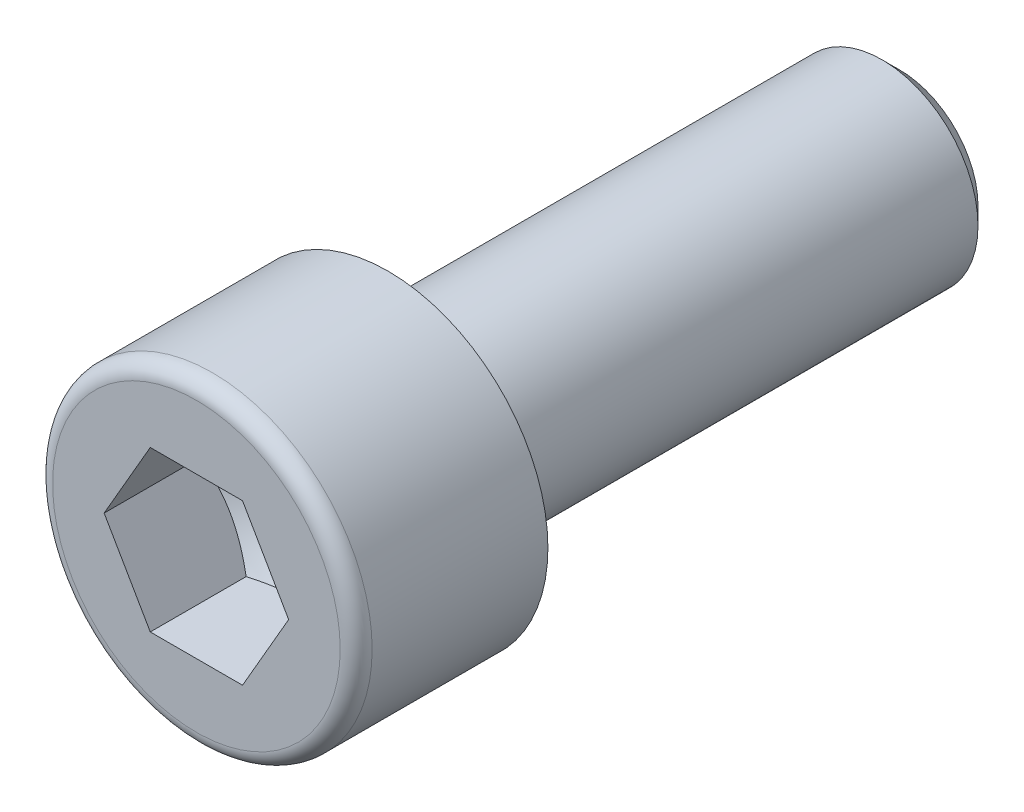
ISO-10303-21;
HEADER;
FILE_DESCRIPTION(('STEP AP214'),'2;1');
FILE_NAME('part.step','',(''),(''),'','','');
FILE_SCHEMA(('AUTOMOTIVE_DESIGN { 1 0 10303 214 1 1 1 1 }'));
ENDSEC;
DATA;
#1=APPLICATION_CONTEXT('core data for automotive mechanical design processes');
#2=APPLICATION_PROTOCOL_DEFINITION('international standard','automotive_design',2000,#1);
#3=PRODUCT_CONTEXT('',#1,'mechanical');
#4=PRODUCT('Part','Part','',(#3));
#5=PRODUCT_RELATED_PRODUCT_CATEGORY('part','',(#4));
#6=PRODUCT_DEFINITION_FORMATION('','',#4);
#7=PRODUCT_DEFINITION_CONTEXT('part definition',#1,'design');
#8=PRODUCT_DEFINITION('design','',#6,#7);
#9=PRODUCT_DEFINITION_SHAPE('','',#8);
#10=(LENGTH_UNIT() NAMED_UNIT(*) SI_UNIT(.MILLI.,.METRE.));
#11=(NAMED_UNIT(*) PLANE_ANGLE_UNIT() SI_UNIT($,.RADIAN.));
#12=(NAMED_UNIT(*) SI_UNIT($,.STERADIAN.) SOLID_ANGLE_UNIT());
#13=UNCERTAINTY_MEASURE_WITH_UNIT(LENGTH_MEASURE(1.E-05),#10,'distance_accuracy_value','');
#14=(GEOMETRIC_REPRESENTATION_CONTEXT(3) GLOBAL_UNCERTAINTY_ASSIGNED_CONTEXT((#13)) GLOBAL_UNIT_ASSIGNED_CONTEXT((#10,
#11,#12)) REPRESENTATION_CONTEXT('',''));
#15=CARTESIAN_POINT('',(0.,0.,0.));
#16=DIRECTION('',(0.,0.,1.));
#17=DIRECTION('',(1.,0.,0.));
#18=AXIS2_PLACEMENT_3D('',#15,#16,#17);
#19=CARTESIAN_POINT('',(0.,0.,6.));
#20=DIRECTION('',(0.,0.,1.));
#21=DIRECTION('',(1.,0.,0.));
#22=AXIS2_PLACEMENT_3D('',#19,#20,#21);
#23=PLANE('',#22);
#24=CARTESIAN_POINT('',(0.,0.,6.));
#25=DIRECTION('',(0.,0.,1.));
#26=DIRECTION('',(1.,0.,0.));
#27=AXIS2_PLACEMENT_3D('',#24,#25,#26);
#28=CIRCLE('',#27,4.5);
#29=CARTESIAN_POINT('',(4.5,0.,6.));
#30=VERTEX_POINT('',#29);
#31=EDGE_CURVE('E11',#30,#30,#28,.T.);
#32=ORIENTED_EDGE('',*,*,#31,.T.);
#33=EDGE_LOOP('',(#32));
#34=FACE_BOUND('',#33,.T.);
#35=DIRECTION('',(1.,0.,0.));
#36=VECTOR('',#35,1.);
#37=CARTESIAN_POINT('',(-1.443375,2.49999883437473,6.));
#38=LINE('',#37,#36);
#39=CARTESIAN_POINT('',(-1.443375,2.49999883437473,6.));
#40=VERTEX_POINT('',#39);
#41=CARTESIAN_POINT('',(1.443375,2.49999883437473,6.));
#42=VERTEX_POINT('',#41);
#43=EDGE_CURVE('E92',#40,#42,#38,.T.);
#44=ORIENTED_EDGE('',*,*,#43,.T.);
#45=DIRECTION('',(0.5,-0.866025403784439,0.));
#46=VECTOR('',#45,1.);
#47=CARTESIAN_POINT('',(1.443375,2.49999883437473,6.));
#48=LINE('',#47,#46);
#49=CARTESIAN_POINT('',(2.88675,0.,6.));
#50=VERTEX_POINT('',#49);
#51=EDGE_CURVE('E31',#42,#50,#48,.T.);
#52=ORIENTED_EDGE('',*,*,#51,.T.);
#53=DIRECTION('',(-0.5,-0.866025403784439,0.));
#54=VECTOR('',#53,1.);
#55=CARTESIAN_POINT('',(2.88675,0.,6.));
#56=LINE('',#55,#54);
#57=CARTESIAN_POINT('',(1.443375,-2.49999883437473,6.));
#58=VERTEX_POINT('',#57);
#59=EDGE_CURVE('E169',#50,#58,#56,.T.);
#60=ORIENTED_EDGE('',*,*,#59,.T.);
#61=DIRECTION('',(-1.,0.,0.));
#62=VECTOR('',#61,1.);
#63=CARTESIAN_POINT('',(1.443375,-2.49999883437473,6.));
#64=LINE('',#63,#62);
#65=CARTESIAN_POINT('',(-1.443375,-2.49999883437473,6.));
#66=VERTEX_POINT('',#65);
#67=EDGE_CURVE('E165',#58,#66,#64,.T.);
#68=ORIENTED_EDGE('',*,*,#67,.T.);
#69=DIRECTION('',(-0.5,0.866025403784439,0.));
#70=VECTOR('',#69,1.);
#71=CARTESIAN_POINT('',(-1.443375,-2.49999883437473,6.));
#72=LINE('',#71,#70);
#73=CARTESIAN_POINT('',(-2.88675,0.,6.));
#74=VERTEX_POINT('',#73);
#75=EDGE_CURVE('E160',#66,#74,#72,.T.);
#76=ORIENTED_EDGE('',*,*,#75,.T.);
#77=DIRECTION('',(0.5,0.866025403784439,0.));
#78=VECTOR('',#77,1.);
#79=CARTESIAN_POINT('',(-2.88675,0.,6.));
#80=LINE('',#79,#78);
#81=EDGE_CURVE('E96',#74,#40,#80,.T.);
#82=ORIENTED_EDGE('',*,*,#81,.T.);
#83=EDGE_LOOP('',(#44,#52,#60,#68,#76,#82));
#84=FACE_BOUND('',#83,.T.);
#85=ADVANCED_FACE('F17',(#34,#84),#23,.T.);
#86=CARTESIAN_POINT('',(0.,0.,5.5));
#87=DIRECTION('',(0.,0.,1.));
#88=DIRECTION('',(1.,0.,0.));
#89=AXIS2_PLACEMENT_3D('',#86,#87,#88);
#90=TOROIDAL_SURFACE('',#89,4.5,0.5);
#91=ORIENTED_EDGE('',*,*,#31,.F.);
#92=EDGE_LOOP('',(#91));
#93=FACE_BOUND('',#92,.T.);
#94=CARTESIAN_POINT('',(0.,0.,5.5));
#95=DIRECTION('',(0.,0.,1.));
#96=DIRECTION('',(1.,0.,0.));
#97=AXIS2_PLACEMENT_3D('',#94,#95,#96);
#98=CIRCLE('',#97,5.);
#99=CARTESIAN_POINT('',(5.,0.,5.5));
#100=VERTEX_POINT('',#99);
#101=EDGE_CURVE('E24',#100,#100,#98,.T.);
#102=ORIENTED_EDGE('',*,*,#101,.T.);
#103=EDGE_LOOP('',(#102));
#104=FACE_BOUND('',#103,.T.);
#105=ADVANCED_FACE('F133',(#93,#104),#90,.T.);
#106=CARTESIAN_POINT('',(0.,0.,6.));
#107=DIRECTION('',(0.,0.,1.));
#108=DIRECTION('',(1.,0.,0.));
#109=AXIS2_PLACEMENT_3D('',#106,#107,#108);
#110=CYLINDRICAL_SURFACE('',#109,5.);
#111=CARTESIAN_POINT('',(0.,0.,0.));
#112=DIRECTION('',(0.,0.,1.));
#113=DIRECTION('',(1.,0.,0.));
#114=AXIS2_PLACEMENT_3D('',#111,#112,#113);
#115=CIRCLE('',#114,5.);
#116=CARTESIAN_POINT('',(5.,0.,0.));
#117=VERTEX_POINT('',#116);
#118=EDGE_CURVE('E128',#117,#117,#115,.T.);
#119=ORIENTED_EDGE('',*,*,#118,.T.);
#120=EDGE_LOOP('',(#119));
#121=FACE_BOUND('',#120,.T.);
#122=ORIENTED_EDGE('',*,*,#101,.F.);
#123=EDGE_LOOP('',(#122));
#124=FACE_BOUND('',#123,.T.);
#125=ADVANCED_FACE('F135',(#121,#124),#110,.T.);
#126=CARTESIAN_POINT('',(0.,5.,0.));
#127=DIRECTION('',(0.,0.,-1.));
#128=DIRECTION('',(-1.,0.,0.));
#129=AXIS2_PLACEMENT_3D('',#126,#127,#128);
#130=PLANE('',#129);
#131=CARTESIAN_POINT('',(0.,0.,0.));
#132=DIRECTION('',(0.,0.,1.));
#133=DIRECTION('',(1.,0.,0.));
#134=AXIS2_PLACEMENT_3D('',#131,#132,#133);
#135=CIRCLE('',#134,3.3);
#136=CARTESIAN_POINT('',(3.3,0.,0.));
#137=VERTEX_POINT('',#136);
#138=EDGE_CURVE('E125',#137,#137,#135,.T.);
#139=ORIENTED_EDGE('',*,*,#138,.T.);
#140=EDGE_LOOP('',(#139));
#141=FACE_BOUND('',#140,.T.);
#142=ORIENTED_EDGE('',*,*,#118,.F.);
#143=EDGE_LOOP('',(#142));
#144=FACE_BOUND('',#143,.T.);
#145=ADVANCED_FACE('F137',(#141,#144),#130,.T.);
#146=CARTESIAN_POINT('',(0.,0.,-0.3));
#147=DIRECTION('',(0.,0.,1.));
#148=DIRECTION('',(1.,0.,0.));
#149=AXIS2_PLACEMENT_3D('',#146,#147,#148);
#150=TOROIDAL_SURFACE('',#149,3.3,0.3);
#151=CARTESIAN_POINT('',(0.,0.,-0.3));
#152=DIRECTION('',(0.,0.,1.));
#153=DIRECTION('',(1.,0.,0.));
#154=AXIS2_PLACEMENT_3D('',#151,#152,#153);
#155=CIRCLE('',#154,3.);
#156=CARTESIAN_POINT('',(3.,0.,-0.3));
#157=VERTEX_POINT('',#156);
#158=EDGE_CURVE('E122',#157,#157,#155,.T.);
#159=ORIENTED_EDGE('',*,*,#158,.T.);
#160=EDGE_LOOP('',(#159));
#161=FACE_BOUND('',#160,.T.);
#162=ORIENTED_EDGE('',*,*,#138,.F.);
#163=EDGE_LOOP('',(#162));
#164=FACE_BOUND('',#163,.T.);
#165=ADVANCED_FACE('F145',(#161,#164),#150,.F.);
#166=CARTESIAN_POINT('',(0.,0.,6.));
#167=DIRECTION('',(0.,0.,1.));
#168=DIRECTION('',(1.,0.,0.));
#169=AXIS2_PLACEMENT_3D('',#166,#167,#168);
#170=CYLINDRICAL_SURFACE('',#169,3.);
#171=CARTESIAN_POINT('',(0.,0.,-0.301));
#172=DIRECTION('',(0.,0.,1.));
#173=DIRECTION('',(1.,0.,0.));
#174=AXIS2_PLACEMENT_3D('',#171,#172,#173);
#175=CIRCLE('',#174,3.);
#176=CARTESIAN_POINT('',(3.,0.,-0.301));
#177=VERTEX_POINT('',#176);
#178=EDGE_CURVE('E119',#177,#177,#175,.T.);
#179=ORIENTED_EDGE('',*,*,#178,.T.);
#180=EDGE_LOOP('',(#179));
#181=FACE_BOUND('',#180,.T.);
#182=ORIENTED_EDGE('',*,*,#158,.F.);
#183=EDGE_LOOP('',(#182));
#184=FACE_BOUND('',#183,.T.);
#185=ADVANCED_FACE('F346',(#181,#184),#170,.T.);
#186=CARTESIAN_POINT('',(0.,0.,-0.301));
#187=DIRECTION('',(0.,0.,1.));
#188=DIRECTION('',(1.,0.,0.));
#189=AXIS2_PLACEMENT_3D('',#186,#187,#188);
#190=CONICAL_SURFACE('',#189,3.,0.523598775598299);
#191=CARTESIAN_POINT('',(0.,0.,-1.23847249959665));
#192=DIRECTION('',(0.,0.,1.));
#193=DIRECTION('',(1.,0.,0.));
#194=AXIS2_PLACEMENT_3D('',#191,#192,#193);
#195=CIRCLE('',#194,2.45875);
#196=CARTESIAN_POINT('',(2.45875,0.,-1.23847249959665));
#197=VERTEX_POINT('',#196);
#198=EDGE_CURVE('E116',#197,#197,#195,.T.);
#199=ORIENTED_EDGE('',*,*,#198,.T.);
#200=EDGE_LOOP('',(#199));
#201=FACE_BOUND('',#200,.T.);
#202=ORIENTED_EDGE('',*,*,#178,.F.);
#203=EDGE_LOOP('',(#202));
#204=FACE_BOUND('',#203,.T.);
#205=ADVANCED_FACE('F337',(#201,#204),#190,.T.);
#206=CARTESIAN_POINT('',(0.,2.45875,-1.23847249959665));
#207=DIRECTION('',(0.,0.,1.));
#208=DIRECTION('',(1.,0.,0.));
#209=AXIS2_PLACEMENT_3D('',#206,#207,#208);
#210=PLANE('',#209);
#211=CARTESIAN_POINT('',(0.,0.,-1.23847249959665));
#212=DIRECTION('',(0.,0.,1.));
#213=DIRECTION('',(1.,0.,0.));
#214=AXIS2_PLACEMENT_3D('',#211,#212,#213);
#215=CIRCLE('',#214,3.);
#216=CARTESIAN_POINT('',(3.,0.,-1.23847249959665));
#217=VERTEX_POINT('',#216);
#218=EDGE_CURVE('E113',#217,#217,#215,.T.);
#219=ORIENTED_EDGE('',*,*,#218,.T.);
#220=EDGE_LOOP('',(#219));
#221=FACE_BOUND('',#220,.T.);
#222=ORIENTED_EDGE('',*,*,#198,.F.);
#223=EDGE_LOOP('',(#222));
#224=FACE_BOUND('',#223,.T.);
#225=ADVANCED_FACE('F322',(#221,#224),#210,.T.);
#226=CARTESIAN_POINT('',(0.,0.,6.));
#227=DIRECTION('',(0.,0.,1.));
#228=DIRECTION('',(1.,0.,0.));
#229=AXIS2_PLACEMENT_3D('',#226,#227,#228);
#230=CYLINDRICAL_SURFACE('',#229,3.);
#231=CARTESIAN_POINT('',(0.,0.,-15.45875));
#232=DIRECTION('',(0.,0.,1.));
#233=DIRECTION('',(1.,0.,0.));
#234=AXIS2_PLACEMENT_3D('',#231,#232,#233);
#235=CIRCLE('',#234,3.);
#236=CARTESIAN_POINT('',(3.,0.,-15.45875));
#237=VERTEX_POINT('',#236);
#238=EDGE_CURVE('E110',#237,#237,#235,.T.);
#239=ORIENTED_EDGE('',*,*,#238,.T.);
#240=EDGE_LOOP('',(#239));
#241=FACE_BOUND('',#240,.T.);
#242=ORIENTED_EDGE('',*,*,#218,.F.);
#243=EDGE_LOOP('',(#242));
#244=FACE_BOUND('',#243,.T.);
#245=ADVANCED_FACE('F311',(#241,#244),#230,.T.);
#246=CARTESIAN_POINT('',(0.,0.,-15.45875));
#247=DIRECTION('',(0.,0.,1.));
#248=DIRECTION('',(1.,0.,0.));
#249=AXIS2_PLACEMENT_3D('',#246,#247,#248);
#250=CONICAL_SURFACE('',#249,3.,0.78539816339745);
#251=CARTESIAN_POINT('',(0.,0.,-16.));
#252=DIRECTION('',(0.,0.,1.));
#253=DIRECTION('',(1.,0.,0.));
#254=AXIS2_PLACEMENT_3D('',#251,#252,#253);
#255=CIRCLE('',#254,2.45875);
#256=CARTESIAN_POINT('',(2.45875,0.,-16.));
#257=VERTEX_POINT('',#256);
#258=EDGE_CURVE('E107',#257,#257,#255,.T.);
#259=ORIENTED_EDGE('',*,*,#258,.T.);
#260=EDGE_LOOP('',(#259));
#261=FACE_BOUND('',#260,.T.);
#262=ORIENTED_EDGE('',*,*,#238,.F.);
#263=EDGE_LOOP('',(#262));
#264=FACE_BOUND('',#263,.T.);
#265=ADVANCED_FACE('F303',(#261,#264),#250,.T.);
#266=CARTESIAN_POINT('',(0.,2.45875,-16.));
#267=DIRECTION('',(0.,0.,-1.));
#268=DIRECTION('',(-1.,0.,0.));
#269=AXIS2_PLACEMENT_3D('',#266,#267,#268);
#270=PLANE('',#269);
#271=ORIENTED_EDGE('',*,*,#258,.F.);
#272=EDGE_LOOP('',(#271));
#273=FACE_BOUND('',#272,.T.);
#274=ADVANCED_FACE('F225',(#273),#270,.T.);
#275=CARTESIAN_POINT('',(1.443375,2.49999883437473,1.33333411041685));
#276=DIRECTION('',(-0.866025403784439,-0.5,0.));
#277=DIRECTION('',(-0.5,0.866025403784439,0.));
#278=AXIS2_PLACEMENT_3D('',#275,#276,#277);
#279=PLANE('',#278);
#280=DIRECTION('',(0.,0.,1.));
#281=VECTOR('',#280,1.);
#282=CARTESIAN_POINT('',(2.88675,0.,1.33333411041685));
#283=LINE('',#282,#281);
#284=CARTESIAN_POINT('',(2.88675,0.,3.));
#285=VERTEX_POINT('',#284);
#286=EDGE_CURVE('E105',#285,#50,#283,.T.);
#287=ORIENTED_EDGE('',*,*,#286,.T.);
#288=ORIENTED_EDGE('',*,*,#51,.F.);
#289=DIRECTION('',(0.,0.,1.));
#290=VECTOR('',#289,1.);
#291=CARTESIAN_POINT('',(1.443375,2.49999883437473,1.33333411041685));
#292=LINE('',#291,#290);
#293=CARTESIAN_POINT('',(1.443375,2.49999883437473,3.));
#294=VERTEX_POINT('',#293);
#295=EDGE_CURVE('E86',#294,#42,#292,.T.);
#296=ORIENTED_EDGE('',*,*,#295,.F.);
#297=CARTESIAN_POINT('',(2.88675011547006,-1.99999999863357E-07,3.00000006666667));
#298=CARTESIAN_POINT('',(2.82332252366581,0.10985961160669,2.96336950967828));
#299=CARTESIAN_POINT('',(2.75934742579574,0.220667731536841,2.93005593436152));
#300=CARTESIAN_POINT('',(2.63028954387127,0.444202540147256,2.87190808727666));
#301=CARTESIAN_POINT('',(2.56520446745334,0.556933199317605,2.84709438377072));
#302=CARTESIAN_POINT('',(2.43584088140159,0.780997503008549,2.80847006268835));
#303=CARTESIAN_POINT('',(2.37158227044588,0.892296682007636,2.7944023489199));
#304=CARTESIAN_POINT('',(2.24276284805613,1.11541846658835,2.77761157054617));
#305=CARTESIAN_POINT('',(2.17820250452486,1.22724026173863,2.77487459839365));
#306=CARTESIAN_POINT('',(2.05757841328359,1.43616731638533,2.78058295689796));
#307=CARTESIAN_POINT('',(2.00149656500914,1.53330392697905,2.7876266963322));
#308=CARTESIAN_POINT('',(1.8896982234341,1.72694433478895,2.80994670830941));
#309=CARTESIAN_POINT('',(1.83398211652594,1.82344746275382,2.82523059787334));
#310=CARTESIAN_POINT('',(1.72195345954662,2.01748678854571,2.86343736615338));
#311=CARTESIAN_POINT('',(1.66565508107193,2.11499844044762,2.88652212541071));
#312=CARTESIAN_POINT('',(1.55389777191142,2.3085677780308,2.93891477048972));
#313=CARTESIAN_POINT('',(1.49843741058811,2.40462794164891,2.96821035401504));
#314=CARTESIAN_POINT('',(1.44337488452994,2.49999903437473,3.00000006666667));
#315=B_SPLINE_CURVE_WITH_KNOTS('',3,(#297,#298,#299,#300,#301,#302,#303,#304,#305,#306,#307,
#308,#309,#310,#311,#312,#313,#314),.UNSPECIFIED.,.F.,.F.,(4,2,2,2,2,2,2,2,4),(0.,
0.396269845497158,0.793491933375094,1.18088400346178,1.56780044062153,1.90463400294076,
2.24177946228527,2.58640119548574,2.93034658115087),.UNSPECIFIED.);
#316=EDGE_CURVE('E79',#285,#294,#315,.T.);
#317=ORIENTED_EDGE('',*,*,#316,.F.);
#318=EDGE_LOOP('',(#287,#288,#296,#317));
#319=FACE_BOUND('',#318,.T.);
#320=ADVANCED_FACE('F87',(#319),#279,.T.);
#321=CARTESIAN_POINT('',(2.88675,0.,1.33333411041685));
#322=DIRECTION('',(-0.866025403784439,0.5,0.));
#323=DIRECTION('',(0.5,0.866025403784439,0.));
#324=AXIS2_PLACEMENT_3D('',#321,#322,#323);
#325=PLANE('',#324);
#326=DIRECTION('',(0.,0.,1.));
#327=VECTOR('',#326,1.);
#328=CARTESIAN_POINT('',(1.443375,-2.49999883437473,1.33333411041685));
#329=LINE('',#328,#327);
#330=CARTESIAN_POINT('',(1.443375,-2.49999883437473,3.));
#331=VERTEX_POINT('',#330);
#332=EDGE_CURVE('E103',#331,#58,#329,.T.);
#333=ORIENTED_EDGE('',*,*,#332,.T.);
#334=ORIENTED_EDGE('',*,*,#59,.F.);
#335=ORIENTED_EDGE('',*,*,#286,.F.);
#336=CARTESIAN_POINT('',(1.44337488452995,-2.49999903437473,3.00000006666667));
#337=CARTESIAN_POINT('',(1.50680247633419,-2.39013922276804,2.96336950967828));
#338=CARTESIAN_POINT('',(1.57077757420426,-2.27933110283789,2.93005593436152));
#339=CARTESIAN_POINT('',(1.69983545612873,-2.05579629422747,2.87190808727666));
#340=CARTESIAN_POINT('',(1.76492053254666,-1.94306563505712,2.84709438377072));
#341=CARTESIAN_POINT('',(1.89428411859841,-1.71900133136618,2.80847006268835));
#342=CARTESIAN_POINT('',(1.95854272955412,-1.60770215236709,2.7944023489199));
#343=CARTESIAN_POINT('',(2.08736215194387,-1.38458036778637,2.77761157054617));
#344=CARTESIAN_POINT('',(2.15192249547514,-1.2727585726361,2.77487459839365));
#345=CARTESIAN_POINT('',(2.27254658671641,-1.06383151798939,2.78058295689796));
#346=CARTESIAN_POINT('',(2.32862843499086,-0.96669490739568,2.7876266963322));
#347=CARTESIAN_POINT('',(2.4404267765659,-0.773054499585779,2.8099467083094));
#348=CARTESIAN_POINT('',(2.49614288347406,-0.676551371620907,2.82523059787334));
#349=CARTESIAN_POINT('',(2.60817154045338,-0.48251204582902,2.86343736615338));
#350=CARTESIAN_POINT('',(2.66446991892807,-0.385000393927105,2.88652212541071));
#351=CARTESIAN_POINT('',(2.77622722808858,-0.191431056343928,2.93891477048972));
#352=CARTESIAN_POINT('',(2.83168758941189,-0.0953708927258217,2.96821035401504));
#353=CARTESIAN_POINT('',(2.88675011547006,1.99999999976406E-07,3.00000006666667));
#354=B_SPLINE_CURVE_WITH_KNOTS('',3,(#336,#337,#338,#339,#340,#341,#342,#343,#344,#345,#346,
#347,#348,#349,#350,#351,#352,#353),.UNSPECIFIED.,.F.,.F.,(4,2,2,2,2,2,2,2,4),(0.,
0.396269845497159,0.793491933375095,1.18088400346178,1.56780044062153,1.90463400294076,
2.24177946228527,2.58640119548574,2.93034658115087),.UNSPECIFIED.);
#355=EDGE_CURVE('E83',#331,#285,#354,.T.);
#356=ORIENTED_EDGE('',*,*,#355,.F.);
#357=EDGE_LOOP('',(#333,#334,#335,#356));
#358=FACE_BOUND('',#357,.T.);
#359=ADVANCED_FACE('F216',(#358),#325,.T.);
#360=CARTESIAN_POINT('',(1.443375,-2.49999883437473,1.33333411041685));
#361=DIRECTION('',(0.,1.,0.));
#362=DIRECTION('',(1.,0.,0.));
#363=AXIS2_PLACEMENT_3D('',#360,#361,#362);
#364=PLANE('',#363);
#365=DIRECTION('',(0.,0.,1.));
#366=VECTOR('',#365,1.);
#367=CARTESIAN_POINT('',(-1.443375,-2.49999883437473,1.33333411041685));
#368=LINE('',#367,#366);
#369=CARTESIAN_POINT('',(-1.443375,-2.49999883437473,3.));
#370=VERTEX_POINT('',#369);
#371=EDGE_CURVE('E101',#370,#66,#368,.T.);
#372=ORIENTED_EDGE('',*,*,#371,.T.);
#373=ORIENTED_EDGE('',*,*,#67,.F.);
#374=ORIENTED_EDGE('',*,*,#332,.F.);
#375=CARTESIAN_POINT('',(-3.73786106214978,-2.49999883437473,3.92958778907324));
#376=CARTESIAN_POINT('',(-3.62896491195938,-2.49999883437473,3.87734398831161));
#377=CARTESIAN_POINT('',(-3.51980131110672,-2.49999883437473,3.82564701620672));
#378=CARTESIAN_POINT('',(-3.30079453275696,-2.49999883437473,3.72366066581967));
#379=CARTESIAN_POINT('',(-3.19095123199839,-2.49999883437473,3.67337155256083));
#380=CARTESIAN_POINT('',(-2.96980741137606,-2.49999883437473,3.57423266172552));
#381=CARTESIAN_POINT('',(-2.85850208851781,-2.49999883437473,3.5253935570836));
#382=CARTESIAN_POINT('',(-2.63494533066189,-2.49999883437473,3.42993961665011));
#383=CARTESIAN_POINT('',(-2.52269394848717,-2.49999883437473,3.38332465762953));
#384=CARTESIAN_POINT('',(-2.2960796228752,-2.49999883437473,3.29252281771904));
#385=CARTESIAN_POINT('',(-2.18170681392527,-2.49999883437473,3.2483604168365));
#386=CARTESIAN_POINT('',(-1.95158478593381,-2.49999883437473,3.16370836718421));
#387=CARTESIAN_POINT('',(-1.83583541308941,-2.49999883437473,3.12321913326025));
#388=CARTESIAN_POINT('',(-1.60304799958039,-2.49999883437473,3.04706130714345));
#389=CARTESIAN_POINT('',(-1.4860136544433,-2.49999883437473,3.01138153954989));
#390=CARTESIAN_POINT('',(-1.25028155584969,-2.49999883437473,2.94604587235114));
#391=CARTESIAN_POINT('',(-1.13158421230429,-2.49999883437473,2.91638851527048));
#392=CARTESIAN_POINT('',(-0.892146141983619,-2.49999883437473,2.86451911091829));
#393=CARTESIAN_POINT('',(-0.771400115486069,-2.49999883437473,2.84233105195638));
#394=CARTESIAN_POINT('',(-0.528550538126974,-2.49999883437473,2.8070567548414));
#395=CARTESIAN_POINT('',(-0.406446967923683,-2.49999883437473,2.7939706465386));
#396=CARTESIAN_POINT('',(-0.162227421037293,-2.49999883437473,2.77805851853028));
#397=CARTESIAN_POINT('',(-0.0401151733531879,-2.49999883437473,2.77517671003708));
#398=CARTESIAN_POINT('',(0.203885891243259,-2.49999883437473,2.77978959871521));
#399=CARTESIAN_POINT('',(0.325774751512606,-2.49999883437473,2.78728200631532));
#400=CARTESIAN_POINT('',(0.536617165080476,-2.49999883437473,2.80870547357712));
#401=CARTESIAN_POINT('',(0.625806204585235,-2.49999883437473,2.82042640123085));
#402=CARTESIAN_POINT('',(0.803437024790562,-2.49999883437473,2.84861382064688));
#403=CARTESIAN_POINT('',(0.891878680031716,-2.49999883437473,2.86508109348135));
#404=CARTESIAN_POINT('',(1.1562492807378,-2.49999883437473,2.92077504184743));
#405=CARTESIAN_POINT('',(1.3308708069745,-2.49999883437473,2.96625356320288));
#406=CARTESIAN_POINT('',(1.59190160301469,-2.49999883437473,3.04393162478608));
#407=CARTESIAN_POINT('',(1.67969059973094,-2.49999883437473,3.0717495689676));
#408=CARTESIAN_POINT('',(1.85442096143946,-2.49999883437473,3.12997740734101));
#409=CARTESIAN_POINT('',(1.94136225311569,-2.49999883437473,3.16038752354637));
#410=CARTESIAN_POINT('',(2.1139610250156,-2.49999883437473,3.22316216485984));
#411=CARTESIAN_POINT('',(2.19962301770649,-2.49999883437473,3.25551440549188));
#412=CARTESIAN_POINT('',(2.37023194830679,-2.49999883437473,3.32197432045096));
#413=CARTESIAN_POINT('',(2.45517911361762,-2.49999883437473,3.35608140990558));
#414=CARTESIAN_POINT('',(2.53982745281954,-2.49999883437473,3.3908988248281));
#415=B_SPLINE_CURVE_WITH_KNOTS('',3,(#375,#376,#377,#378,#379,#380,#381,#382,#383,#384,#385,
#386,#387,#388,#389,#390,#391,#392,#393,#394,#395,#396,#397,#398,#399,#400,#401,#402,#403,#404,
#405,#406,#407,#408,#409,#410,#411,#412,#413,#414),.UNSPECIFIED.,.F.,.F.,(4,2,2,2,2,2,2,2,2,2,2,
2,2,2,2,2,2,2,2,4),(0.,0.362345077461351,0.724757912306451,1.08938530048732,1.45399246293536,
1.82175226930555,2.18955355872751,2.55648491480033,2.92332736420018,3.29133696448628,
3.65935181476395,4.02535152666688,4.39127047595122,4.66100477488141,4.93078348742953,
5.47140222651042,5.74765583222639,6.02393312223645,6.29861688003657,6.57320967433308),.UNSPECIFIED.);
#416=EDGE_CURVE('E207',#370,#331,#415,.T.);
#417=ORIENTED_EDGE('',*,*,#416,.F.);
#418=EDGE_LOOP('',(#372,#373,#374,#417));
#419=FACE_BOUND('',#418,.T.);
#420=ADVANCED_FACE('F212',(#419),#364,.T.);
#421=CARTESIAN_POINT('',(-1.443375,-2.49999883437473,1.33333411041685));
#422=DIRECTION('',(0.866025403784439,0.5,0.));
#423=DIRECTION('',(0.5,-0.866025403784439,0.));
#424=AXIS2_PLACEMENT_3D('',#421,#422,#423);
#425=PLANE('',#424);
#426=DIRECTION('',(0.,0.,1.));
#427=VECTOR('',#426,1.);
#428=CARTESIAN_POINT('',(-2.88675,0.,1.33333411041685));
#429=LINE('',#428,#427);
#430=CARTESIAN_POINT('',(-2.88675,0.,3.));
#431=VERTEX_POINT('',#430);
#432=EDGE_CURVE('E94',#431,#74,#429,.T.);
#433=ORIENTED_EDGE('',*,*,#432,.T.);
#434=ORIENTED_EDGE('',*,*,#75,.F.);
#435=ORIENTED_EDGE('',*,*,#371,.F.);
#436=CARTESIAN_POINT('',(-2.88675011547006,2.E-07,3.00000006666667));
#437=CARTESIAN_POINT('',(-2.82332252366581,-0.109859611606689,2.96336950967828));
#438=CARTESIAN_POINT('',(-2.75934742579574,-0.220667731536841,2.93005593436152));
#439=CARTESIAN_POINT('',(-2.63028954387127,-0.444202540147256,2.87190808727666));
#440=CARTESIAN_POINT('',(-2.56520446745334,-0.556933199317605,2.84709438377072));
#441=CARTESIAN_POINT('',(-2.43584088140159,-0.78099750300855,2.80847006268835));
#442=CARTESIAN_POINT('',(-2.37158227044588,-0.892296682007636,2.7944023489199));
#443=CARTESIAN_POINT('',(-2.24276284805613,-1.11541846658835,2.77761157054617));
#444=CARTESIAN_POINT('',(-2.17820250452486,-1.22724026173863,2.77487459839365));
#445=CARTESIAN_POINT('',(-2.05757841328359,-1.43616731638533,2.78058295689796));
#446=CARTESIAN_POINT('',(-2.00149656500914,-1.53330392697905,2.7876266963322));
#447=CARTESIAN_POINT('',(-1.8896982234341,-1.72694433478895,2.80994670830941));
#448=CARTESIAN_POINT('',(-1.83398211652594,-1.82344746275382,2.82523059787334));
#449=CARTESIAN_POINT('',(-1.72195345954662,-2.01748678854571,2.86343736615338));
#450=CARTESIAN_POINT('',(-1.66565508107193,-2.11499844044762,2.88652212541071));
#451=CARTESIAN_POINT('',(-1.55389777191142,-2.3085677780308,2.93891477048972));
#452=CARTESIAN_POINT('',(-1.49843741058811,-2.40462794164891,2.96821035401504));
#453=CARTESIAN_POINT('',(-1.44337488452995,-2.49999903437473,3.00000006666667));
#454=B_SPLINE_CURVE_WITH_KNOTS('',3,(#436,#437,#438,#439,#440,#441,#442,#443,#444,#445,#446,
#447,#448,#449,#450,#451,#452,#453),.UNSPECIFIED.,.F.,.F.,(4,2,2,2,2,2,2,2,4),(0.,
0.396269845497158,0.793491933375094,1.18088400346178,1.56780044062153,1.90463400294076,
2.24177946228527,2.58640119548574,2.93034658115087),.UNSPECIFIED.);
#455=EDGE_CURVE('E202',#431,#370,#454,.T.);
#456=ORIENTED_EDGE('',*,*,#455,.F.);
#457=EDGE_LOOP('',(#433,#434,#435,#456));
#458=FACE_BOUND('',#457,.T.);
#459=ADVANCED_FACE('F215',(#458),#425,.T.);
#460=CARTESIAN_POINT('',(-2.88675,0.,1.33333411041685));
#461=DIRECTION('',(0.866025403784439,-0.5,0.));
#462=DIRECTION('',(-0.5,-0.866025403784439,0.));
#463=AXIS2_PLACEMENT_3D('',#460,#461,#462);
#464=PLANE('',#463);
#465=DIRECTION('',(0.,0.,1.));
#466=VECTOR('',#465,1.);
#467=CARTESIAN_POINT('',(-1.443375,2.49999883437473,1.33333411041685));
#468=LINE('',#467,#466);
#469=CARTESIAN_POINT('',(-1.443375,2.49999883437473,3.));
#470=VERTEX_POINT('',#469);
#471=EDGE_CURVE('E91',#470,#40,#468,.T.);
#472=ORIENTED_EDGE('',*,*,#471,.T.);
#473=ORIENTED_EDGE('',*,*,#81,.F.);
#474=ORIENTED_EDGE('',*,*,#432,.F.);
#475=CARTESIAN_POINT('',(-1.44337488452995,2.49999903437473,3.00000006666667));
#476=CARTESIAN_POINT('',(-1.50680247633419,2.39013922276804,2.96336950967828));
#477=CARTESIAN_POINT('',(-1.57077757420426,2.27933110283789,2.93005593436152));
#478=CARTESIAN_POINT('',(-1.69983545612874,2.05579629422747,2.87190808727665));
#479=CARTESIAN_POINT('',(-1.76492053254666,1.94306563505712,2.84709438377072));
#480=CARTESIAN_POINT('',(-1.89428411859841,1.71900133136618,2.80847006268835));
#481=CARTESIAN_POINT('',(-1.95854272955412,1.60770215236709,2.7944023489199));
#482=CARTESIAN_POINT('',(-2.08736215194387,1.38458036778637,2.77761157054617));
#483=CARTESIAN_POINT('',(-2.15192249547514,1.2727585726361,2.77487459839365));
#484=CARTESIAN_POINT('',(-2.27254658671641,1.06383151798939,2.78058295689796));
#485=CARTESIAN_POINT('',(-2.32862843499086,0.966694907395678,2.7876266963322));
#486=CARTESIAN_POINT('',(-2.4404267765659,0.773054499585779,2.8099467083094));
#487=CARTESIAN_POINT('',(-2.49614288347406,0.676551371620906,2.82523059787334));
#488=CARTESIAN_POINT('',(-2.60817154045338,0.48251204582902,2.86343736615338));
#489=CARTESIAN_POINT('',(-2.66446991892807,0.385000393927105,2.88652212541071));
#490=CARTESIAN_POINT('',(-2.77622722808858,0.191431056343928,2.93891477048972));
#491=CARTESIAN_POINT('',(-2.83168758941189,0.0953708927258217,2.96821035401504));
#492=CARTESIAN_POINT('',(-2.88675011547006,-2.00000000044562E-07,3.00000006666667));
#493=B_SPLINE_CURVE_WITH_KNOTS('',3,(#475,#476,#477,#478,#479,#480,#481,#482,#483,#484,#485,
#486,#487,#488,#489,#490,#491,#492),.UNSPECIFIED.,.F.,.F.,(4,2,2,2,2,2,2,2,4),(0.,
0.396269845497157,0.793491933375093,1.18088400346178,1.56780044062153,1.90463400294076,
2.24177946228527,2.58640119548574,2.93034658115087),.UNSPECIFIED.);
#494=EDGE_CURVE('E39',#470,#431,#493,.T.);
#495=ORIENTED_EDGE('',*,*,#494,.F.);
#496=EDGE_LOOP('',(#472,#473,#474,#495));
#497=FACE_BOUND('',#496,.T.);
#498=ADVANCED_FACE('F159',(#497),#464,.T.);
#499=CARTESIAN_POINT('',(-1.443375,2.49999883437473,1.33333411041685));
#500=DIRECTION('',(0.,-1.,0.));
#501=DIRECTION('',(-1.,0.,0.));
#502=AXIS2_PLACEMENT_3D('',#499,#500,#501);
#503=PLANE('',#502);
#504=ORIENTED_EDGE('',*,*,#295,.T.);
#505=ORIENTED_EDGE('',*,*,#43,.F.);
#506=ORIENTED_EDGE('',*,*,#471,.F.);
#507=CARTESIAN_POINT('',(-3.73786106214979,2.49999883437473,3.92958778907324));
#508=CARTESIAN_POINT('',(-3.62896491195938,2.49999883437473,3.87734398831161));
#509=CARTESIAN_POINT('',(-3.51980131110672,2.49999883437473,3.82564701620672));
#510=CARTESIAN_POINT('',(-3.30079453275696,2.49999883437473,3.72366066581967));
#511=CARTESIAN_POINT('',(-3.1909512319984,2.49999883437473,3.67337155256083));
#512=CARTESIAN_POINT('',(-2.96980741137607,2.49999883437473,3.57423266172552));
#513=CARTESIAN_POINT('',(-2.85850208851781,2.49999883437473,3.5253935570836));
#514=CARTESIAN_POINT('',(-2.6349453306619,2.49999883437473,3.42993961665011));
#515=CARTESIAN_POINT('',(-2.52269394848718,2.49999883437473,3.38332465762953));
#516=CARTESIAN_POINT('',(-2.2960796228752,2.49999883437473,3.29252281771904));
#517=CARTESIAN_POINT('',(-2.18170681392528,2.49999883437473,3.2483604168365));
#518=CARTESIAN_POINT('',(-1.95158478593381,2.49999883437473,3.16370836718421));
#519=CARTESIAN_POINT('',(-1.83583541308942,2.49999883437473,3.12321913326026));
#520=CARTESIAN_POINT('',(-1.60304799958039,2.49999883437473,3.04706130714345));
#521=CARTESIAN_POINT('',(-1.4860136544433,2.49999883437473,3.01138153954989));
#522=CARTESIAN_POINT('',(-1.2502815558497,2.49999883437473,2.94604587235114));
#523=CARTESIAN_POINT('',(-1.1315842123043,2.49999883437473,2.91638851527048));
#524=CARTESIAN_POINT('',(-0.892146141983622,2.49999883437473,2.86451911091829));
#525=CARTESIAN_POINT('',(-0.771400115486072,2.49999883437473,2.84233105195638));
#526=CARTESIAN_POINT('',(-0.528550538126977,2.49999883437473,2.8070567548414));
#527=CARTESIAN_POINT('',(-0.406446967923686,2.49999883437473,2.7939706465386));
#528=CARTESIAN_POINT('',(-0.162227421037296,2.49999883437473,2.77805851853028));
#529=CARTESIAN_POINT('',(-0.0401151733531905,2.49999883437473,2.77517671003708));
#530=CARTESIAN_POINT('',(0.203885891243256,2.49999883437473,2.77978959871521));
#531=CARTESIAN_POINT('',(0.325774751512604,2.49999883437473,2.78728200631532));
#532=CARTESIAN_POINT('',(0.536617165080473,2.49999883437473,2.80870547357712));
#533=CARTESIAN_POINT('',(0.625806204585233,2.49999883437473,2.82042640123085));
#534=CARTESIAN_POINT('',(0.80343702479056,2.49999883437473,2.84861382064688));
#535=CARTESIAN_POINT('',(0.891878680031713,2.49999883437473,2.86508109348135));
#536=CARTESIAN_POINT('',(1.1562492807378,2.49999883437473,2.92077504184743));
#537=CARTESIAN_POINT('',(1.3308708069745,2.49999883437473,2.96625356320288));
#538=CARTESIAN_POINT('',(1.59190160301469,2.49999883437473,3.04393162478608));
#539=CARTESIAN_POINT('',(1.67969059973094,2.49999883437473,3.0717495689676));
#540=CARTESIAN_POINT('',(1.85442096143945,2.49999883437473,3.12997740734101));
#541=CARTESIAN_POINT('',(1.94136225311568,2.49999883437473,3.16038752354637));
#542=CARTESIAN_POINT('',(2.1139610250156,2.49999883437473,3.22316216485984));
#543=CARTESIAN_POINT('',(2.19962301770648,2.49999883437473,3.25551440549188));
#544=CARTESIAN_POINT('',(2.37023194830679,2.49999883437473,3.32197432045096));
#545=CARTESIAN_POINT('',(2.45517911361761,2.49999883437473,3.35608140990557));
#546=CARTESIAN_POINT('',(2.53982745281954,2.49999883437473,3.3908988248281));
#547=B_SPLINE_CURVE_WITH_KNOTS('',3,(#507,#508,#509,#510,#511,#512,#513,#514,#515,#516,#517,
#518,#519,#520,#521,#522,#523,#524,#525,#526,#527,#528,#529,#530,#531,#532,#533,#534,#535,#536,
#537,#538,#539,#540,#541,#542,#543,#544,#545,#546),.UNSPECIFIED.,.F.,.F.,(4,2,2,2,2,2,2,2,2,2,2,
2,2,2,2,2,2,2,2,4),(0.,0.36234507746135,0.724757912306449,1.08938530048732,1.45399246293535,
1.82175226930555,2.18955355872751,2.55648491480033,2.92332736420018,3.29133696448628,
3.65935181476395,4.02535152666688,4.39127047595122,4.66100477488141,4.93078348742953,
5.47140222651042,5.74765583222639,6.02393312223645,6.29861688003657,6.57320967433308),.UNSPECIFIED.);
#548=EDGE_CURVE('E80',#294,#470,#547,.F.);
#549=ORIENTED_EDGE('',*,*,#548,.F.);
#550=EDGE_LOOP('',(#504,#505,#506,#549));
#551=FACE_BOUND('',#550,.T.);
#552=ADVANCED_FACE('F75',(#551),#503,.T.);
#553=CARTESIAN_POINT('',(0.,0.,1.33333411041685));
#554=DIRECTION('',(0.,0.,1.));
#555=DIRECTION('',(1.,0.,0.));
#556=AXIS2_PLACEMENT_3D('',#553,#554,#555);
#557=CONICAL_SURFACE('',#556,0.,1.0471975511966);
#558=CARTESIAN_POINT('',(0.,0.,1.33333411041685));
#559=VERTEX_POINT('',#558);
#560=VERTEX_LOOP('',#559);
#561=FACE_BOUND('',#560,.T.);
#562=ORIENTED_EDGE('',*,*,#316,.T.);
#563=ORIENTED_EDGE('',*,*,#548,.T.);
#564=ORIENTED_EDGE('',*,*,#494,.T.);
#565=ORIENTED_EDGE('',*,*,#455,.T.);
#566=ORIENTED_EDGE('',*,*,#416,.T.);
#567=ORIENTED_EDGE('',*,*,#355,.T.);
#568=EDGE_LOOP('',(#562,#563,#564,#565,#566,#567));
#569=FACE_BOUND('',#568,.T.);
#570=ADVANCED_FACE('F72',(#561,#569),#557,.F.);
#571=CLOSED_SHELL('',(#85,#105,#125,#145,#165,#185,#205,#225,#245,#265,#274,#320,#359,#420,#459,
#498,#552,#570));
#572=MANIFOLD_SOLID_BREP('B1',#571);
#573=ADVANCED_BREP_SHAPE_REPRESENTATION('',(#18,#572),#14);
#574=SHAPE_DEFINITION_REPRESENTATION(#9,#573);
ENDSEC;
END-ISO-10303-21;
